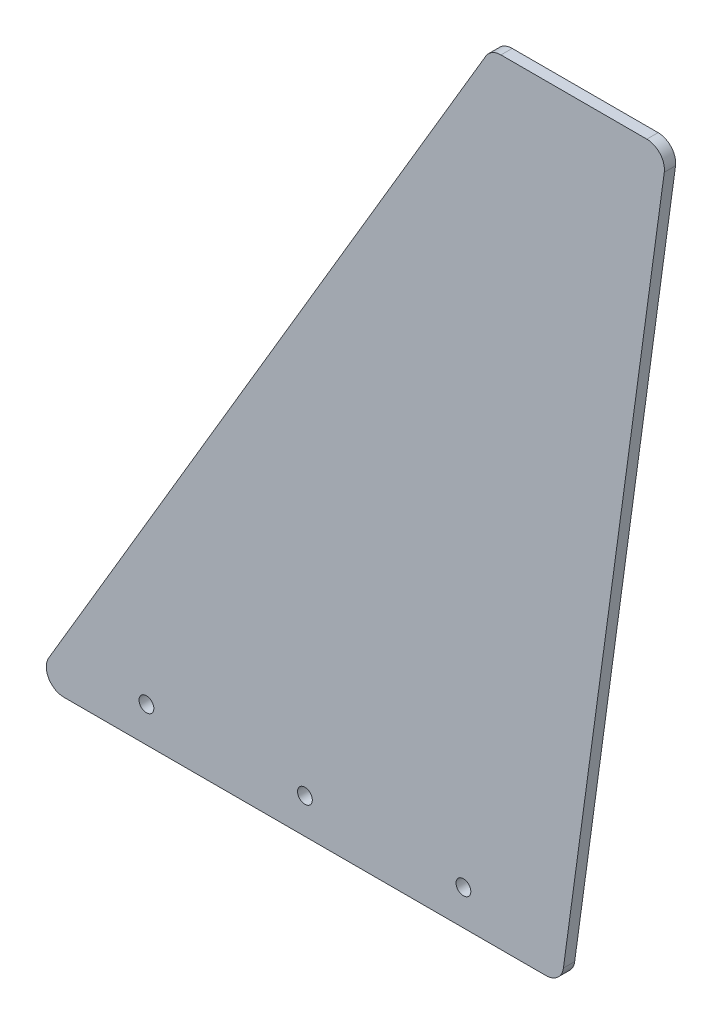
ISO-10303-21;
HEADER;
FILE_DESCRIPTION(('STEP AP214'),'2;1');
FILE_NAME('part.step','',(''),(''),'','','');
FILE_SCHEMA(('AUTOMOTIVE_DESIGN { 1 0 10303 214 1 1 1 1 }'));
ENDSEC;
DATA;
#1=APPLICATION_CONTEXT('core data for automotive mechanical design processes');
#2=APPLICATION_PROTOCOL_DEFINITION('international standard','automotive_design',2000,#1);
#3=PRODUCT_CONTEXT('',#1,'mechanical');
#4=PRODUCT('Part','Part','',(#3));
#5=PRODUCT_RELATED_PRODUCT_CATEGORY('part','',(#4));
#6=PRODUCT_DEFINITION_FORMATION('','',#4);
#7=PRODUCT_DEFINITION_CONTEXT('part definition',#1,'design');
#8=PRODUCT_DEFINITION('design','',#6,#7);
#9=PRODUCT_DEFINITION_SHAPE('','',#8);
#10=(LENGTH_UNIT() NAMED_UNIT(*) SI_UNIT(.MILLI.,.METRE.));
#11=(NAMED_UNIT(*) PLANE_ANGLE_UNIT() SI_UNIT($,.RADIAN.));
#12=(NAMED_UNIT(*) SI_UNIT($,.STERADIAN.) SOLID_ANGLE_UNIT());
#13=UNCERTAINTY_MEASURE_WITH_UNIT(LENGTH_MEASURE(1.E-05),#10,'distance_accuracy_value','');
#14=(GEOMETRIC_REPRESENTATION_CONTEXT(3) GLOBAL_UNCERTAINTY_ASSIGNED_CONTEXT((#13)) GLOBAL_UNIT_ASSIGNED_CONTEXT((#10,
#11,#12)) REPRESENTATION_CONTEXT('',''));
#15=CARTESIAN_POINT('',(0.,0.,0.));
#16=DIRECTION('',(0.,0.,1.));
#17=DIRECTION('',(1.,0.,0.));
#18=AXIS2_PLACEMENT_3D('',#15,#16,#17);
#19=CARTESIAN_POINT('',(130.,220.,3.2));
#20=DIRECTION('',(0.860926528214316,-0.508729312126641,0.));
#21=DIRECTION('',(0.508729312126641,0.860926528214316,0.));
#22=AXIS2_PLACEMENT_3D('',#19,#20,#21);
#23=PLANE('',#22);
#24=DIRECTION('',(-0.508729312126641,-0.860926528214315,0.));
#25=VECTOR('',#24,1.);
#26=CARTESIAN_POINT('',(130.,220.,0.));
#27=LINE('',#26,#25);
#28=CARTESIAN_POINT('',(128.548518422192,217.543646560633,0.));
#29=VERTEX_POINT('',#28);
#30=CARTESIAN_POINT('',(4.45760933128331,7.54364656063328,0.));
#31=VERTEX_POINT('',#30);
#32=EDGE_CURVE('E134',#29,#31,#27,.T.);
#33=ORIENTED_EDGE('',*,*,#32,.T.);
#34=DIRECTION('',(0.,0.,-1.));
#35=VECTOR('',#34,1.);
#36=CARTESIAN_POINT('',(4.45760933128331,7.54364656063325,3.2));
#37=LINE('',#36,#35);
#38=CARTESIAN_POINT('',(4.45760933128331,7.54364656063328,3.2));
#39=VERTEX_POINT('',#38);
#40=EDGE_CURVE('E112',#31,#39,#37,.F.);
#41=ORIENTED_EDGE('',*,*,#40,.T.);
#42=DIRECTION('',(-0.508729312126641,-0.860926528214315,0.));
#43=VECTOR('',#42,1.);
#44=CARTESIAN_POINT('',(130.,220.,3.2));
#45=LINE('',#44,#43);
#46=CARTESIAN_POINT('',(128.548518422192,217.543646560633,3.2));
#47=VERTEX_POINT('',#46);
#48=EDGE_CURVE('E144',#47,#39,#45,.T.);
#49=ORIENTED_EDGE('',*,*,#48,.F.);
#50=DIRECTION('',(0.,0.,-1.));
#51=VECTOR('',#50,1.);
#52=CARTESIAN_POINT('',(128.548518422192,217.543646560633,3.2));
#53=LINE('',#52,#51);
#54=EDGE_CURVE('E117',#47,#29,#53,.T.);
#55=ORIENTED_EDGE('',*,*,#54,.T.);
#56=EDGE_LOOP('',(#33,#41,#49,#55));
#57=FACE_BOUND('',#56,.T.);
#58=ADVANCED_FACE('F41',(#57),#23,.F.);
#59=CARTESIAN_POINT('',(0.,0.,3.2));
#60=DIRECTION('',(0.,1.,0.));
#61=DIRECTION('',(0.,0.,1.));
#62=AXIS2_PLACEMENT_3D('',#59,#60,#61);
#63=PLANE('',#62);
#64=DIRECTION('',(1.,0.,0.));
#65=VECTOR('',#64,1.);
#66=CARTESIAN_POINT('',(0.,0.,3.2));
#67=LINE('',#66,#65);
#68=CARTESIAN_POINT('',(8.76224197235489,0.,3.2));
#69=VERTEX_POINT('',#68);
#70=CARTESIAN_POINT('',(145.635544702006,0.,3.2));
#71=VERTEX_POINT('',#70);
#72=EDGE_CURVE('E127',#69,#71,#67,.T.);
#73=ORIENTED_EDGE('',*,*,#72,.F.);
#74=DIRECTION('',(0.,0.,-1.));
#75=VECTOR('',#74,1.);
#76=CARTESIAN_POINT('',(8.76224197235489,0.,3.2));
#77=LINE('',#76,#75);
#78=CARTESIAN_POINT('',(8.76224197235489,0.,0.));
#79=VERTEX_POINT('',#78);
#80=EDGE_CURVE('E111',#69,#79,#77,.T.);
#81=ORIENTED_EDGE('',*,*,#80,.T.);
#82=DIRECTION('',(1.,0.,0.));
#83=VECTOR('',#82,1.);
#84=CARTESIAN_POINT('',(0.,0.,0.));
#85=LINE('',#84,#83);
#86=CARTESIAN_POINT('',(145.635544702006,0.,0.));
#87=VERTEX_POINT('',#86);
#88=EDGE_CURVE('E124',#79,#87,#85,.T.);
#89=ORIENTED_EDGE('',*,*,#88,.T.);
#90=DIRECTION('',(0.,0.,-1.));
#91=VECTOR('',#90,1.);
#92=CARTESIAN_POINT('',(145.635544702006,0.,3.2));
#93=LINE('',#92,#91);
#94=EDGE_CURVE('E129',#87,#71,#93,.F.);
#95=ORIENTED_EDGE('',*,*,#94,.T.);
#96=EDGE_LOOP('',(#73,#81,#89,#95));
#97=FACE_BOUND('',#96,.T.);
#98=ADVANCED_FACE('F123',(#97),#63,.F.);
#99=CARTESIAN_POINT('',(150.,0.,3.2));
#100=DIRECTION('',(-0.990830168044299,0.135113204733313,0.));
#101=DIRECTION('',(-0.135113204733313,-0.990830168044299,0.));
#102=AXIS2_PLACEMENT_3D('',#99,#100,#101);
#103=PLANE('',#102);
#104=DIRECTION('',(0.135113204733313,0.990830168044299,0.));
#105=VECTOR('',#104,1.);
#106=CARTESIAN_POINT('',(150.,0.,3.2));
#107=LINE('',#106,#105);
#108=CARTESIAN_POINT('',(150.589695542227,4.32443397633344,3.2));
#109=VERTEX_POINT('',#108);
#110=CARTESIAN_POINT('',(179.226059178591,214.324433976333,3.2));
#111=VERTEX_POINT('',#110);
#112=EDGE_CURVE('E170',#109,#111,#107,.T.);
#113=ORIENTED_EDGE('',*,*,#112,.F.);
#114=DIRECTION('',(0.,0.,-1.));
#115=VECTOR('',#114,1.);
#116=CARTESIAN_POINT('',(150.589695542227,4.32443397633343,3.2));
#117=LINE('',#116,#115);
#118=CARTESIAN_POINT('',(150.589695542227,4.32443397633344,0.));
#119=VERTEX_POINT('',#118);
#120=EDGE_CURVE('E163',#109,#119,#117,.T.);
#121=ORIENTED_EDGE('',*,*,#120,.T.);
#122=DIRECTION('',(0.135113204733313,0.990830168044299,0.));
#123=VECTOR('',#122,1.);
#124=CARTESIAN_POINT('',(150.,0.,0.));
#125=LINE('',#124,#123);
#126=CARTESIAN_POINT('',(179.226059178591,214.324433976333,0.));
#127=VERTEX_POINT('',#126);
#128=EDGE_CURVE('E133',#119,#127,#125,.T.);
#129=ORIENTED_EDGE('',*,*,#128,.T.);
#130=DIRECTION('',(0.,0.,-1.));
#131=VECTOR('',#130,1.);
#132=CARTESIAN_POINT('',(179.226059178591,214.324433976333,3.2));
#133=LINE('',#132,#131);
#134=EDGE_CURVE('E161',#127,#111,#133,.F.);
#135=ORIENTED_EDGE('',*,*,#134,.T.);
#136=EDGE_LOOP('',(#113,#121,#129,#135));
#137=FACE_BOUND('',#136,.T.);
#138=ADVANCED_FACE('F168',(#137),#103,.F.);
#139=CARTESIAN_POINT('',(180.,220.,3.2));
#140=DIRECTION('',(0.,-1.,0.));
#141=DIRECTION('',(0.,0.,-1.));
#142=AXIS2_PLACEMENT_3D('',#139,#140,#141);
#143=PLANE('',#142);
#144=DIRECTION('',(-1.,0.,0.));
#145=VECTOR('',#144,1.);
#146=CARTESIAN_POINT('',(180.,220.,3.2));
#147=LINE('',#146,#145);
#148=CARTESIAN_POINT('',(174.271908338369,220.,3.2));
#149=VERTEX_POINT('',#148);
#150=CARTESIAN_POINT('',(132.853151063264,220.,3.2));
#151=VERTEX_POINT('',#150);
#152=EDGE_CURVE('E145',#149,#151,#147,.T.);
#153=ORIENTED_EDGE('',*,*,#152,.F.);
#154=DIRECTION('',(0.,0.,-1.));
#155=VECTOR('',#154,1.);
#156=CARTESIAN_POINT('',(174.271908338369,220.,3.2));
#157=LINE('',#156,#155);
#158=CARTESIAN_POINT('',(174.271908338369,220.,0.));
#159=VERTEX_POINT('',#158);
#160=EDGE_CURVE('E11',#149,#159,#157,.T.);
#161=ORIENTED_EDGE('',*,*,#160,.T.);
#162=DIRECTION('',(-1.,0.,0.));
#163=VECTOR('',#162,1.);
#164=CARTESIAN_POINT('',(180.,220.,0.));
#165=LINE('',#164,#163);
#166=CARTESIAN_POINT('',(132.853151063264,220.,0.));
#167=VERTEX_POINT('',#166);
#168=EDGE_CURVE('E137',#159,#167,#165,.T.);
#169=ORIENTED_EDGE('',*,*,#168,.T.);
#170=DIRECTION('',(0.,0.,-1.));
#171=VECTOR('',#170,1.);
#172=CARTESIAN_POINT('',(132.853151063264,220.,3.2));
#173=LINE('',#172,#171);
#174=EDGE_CURVE('E49',#167,#151,#173,.F.);
#175=ORIENTED_EDGE('',*,*,#174,.T.);
#176=EDGE_LOOP('',(#153,#161,#169,#175));
#177=FACE_BOUND('',#176,.T.);
#178=ADVANCED_FACE('F177',(#177),#143,.F.);
#179=CARTESIAN_POINT('',(0.,0.,3.2));
#180=DIRECTION('',(0.,0.,1.));
#181=DIRECTION('',(1.,0.,0.));
#182=AXIS2_PLACEMENT_3D('',#179,#180,#181);
#183=PLANE('',#182);
#184=CARTESIAN_POINT('',(122.19889333718,10.,3.2));
#185=DIRECTION('',(0.,0.,1.));
#186=DIRECTION('',(1.,0.,0.));
#187=AXIS2_PLACEMENT_3D('',#184,#185,#186);
#188=CIRCLE('',#187,2.1);
#189=CARTESIAN_POINT('',(124.29889333718,10.,3.2));
#190=VERTEX_POINT('',#189);
#191=EDGE_CURVE('E187',#190,#190,#188,.T.);
#192=ORIENTED_EDGE('',*,*,#191,.F.);
#193=EDGE_LOOP('',(#192));
#194=FACE_BOUND('',#193,.T.);
#195=CARTESIAN_POINT('',(32.1988933371803,10.,3.2));
#196=DIRECTION('',(0.,0.,1.));
#197=DIRECTION('',(1.,0.,0.));
#198=AXIS2_PLACEMENT_3D('',#195,#196,#197);
#199=CIRCLE('',#198,2.1);
#200=CARTESIAN_POINT('',(34.2988933371804,10.,3.2));
#201=VERTEX_POINT('',#200);
#202=EDGE_CURVE('E190',#201,#201,#199,.T.);
#203=ORIENTED_EDGE('',*,*,#202,.F.);
#204=EDGE_LOOP('',(#203));
#205=FACE_BOUND('',#204,.T.);
#206=CARTESIAN_POINT('',(77.1988933371803,10.,3.2));
#207=DIRECTION('',(0.,0.,1.));
#208=DIRECTION('',(1.,0.,0.));
#209=AXIS2_PLACEMENT_3D('',#206,#207,#208);
#210=CIRCLE('',#209,2.1);
#211=CARTESIAN_POINT('',(79.2988933371803,10.,3.2));
#212=VERTEX_POINT('',#211);
#213=EDGE_CURVE('E184',#212,#212,#210,.T.);
#214=ORIENTED_EDGE('',*,*,#213,.F.);
#215=EDGE_LOOP('',(#214));
#216=FACE_BOUND('',#215,.T.);
#217=ORIENTED_EDGE('',*,*,#48,.T.);
#218=CARTESIAN_POINT('',(8.76224197235489,5.,3.2));
#219=DIRECTION('',(0.,0.,1.));
#220=DIRECTION('',(1.,0.,0.));
#221=AXIS2_PLACEMENT_3D('',#218,#219,#220);
#222=CIRCLE('',#221,5.);
#223=EDGE_CURVE('E159',#39,#69,#222,.T.);
#224=ORIENTED_EDGE('',*,*,#223,.T.);
#225=ORIENTED_EDGE('',*,*,#72,.T.);
#226=CARTESIAN_POINT('',(145.635544702006,5.,3.2));
#227=DIRECTION('',(0.,0.,1.));
#228=DIRECTION('',(1.,0.,0.));
#229=AXIS2_PLACEMENT_3D('',#226,#227,#228);
#230=CIRCLE('',#229,5.);
#231=EDGE_CURVE('E157',#71,#109,#230,.T.);
#232=ORIENTED_EDGE('',*,*,#231,.T.);
#233=ORIENTED_EDGE('',*,*,#112,.T.);
#234=CARTESIAN_POINT('',(174.271908338369,215.,3.2));
#235=DIRECTION('',(0.,0.,1.));
#236=DIRECTION('',(1.,0.,0.));
#237=AXIS2_PLACEMENT_3D('',#234,#235,#236);
#238=CIRCLE('',#237,5.);
#239=EDGE_CURVE('E62',#111,#149,#238,.T.);
#240=ORIENTED_EDGE('',*,*,#239,.T.);
#241=ORIENTED_EDGE('',*,*,#152,.T.);
#242=CARTESIAN_POINT('',(132.853151063264,215.,3.2));
#243=DIRECTION('',(0.,0.,1.));
#244=DIRECTION('',(1.,0.,0.));
#245=AXIS2_PLACEMENT_3D('',#242,#243,#244);
#246=CIRCLE('',#245,5.);
#247=EDGE_CURVE('E154',#151,#47,#246,.T.);
#248=ORIENTED_EDGE('',*,*,#247,.T.);
#249=EDGE_LOOP('',(#217,#224,#225,#232,#233,#240,#241,#248));
#250=FACE_BOUND('',#249,.T.);
#251=ADVANCED_FACE('F211',(#194,#205,#216,#250),#183,.T.);
#252=CARTESIAN_POINT('',(0.,0.,0.));
#253=DIRECTION('',(0.,0.,1.));
#254=DIRECTION('',(1.,0.,0.));
#255=AXIS2_PLACEMENT_3D('',#252,#253,#254);
#256=PLANE('',#255);
#257=CARTESIAN_POINT('',(122.19889333718,10.,0.));
#258=DIRECTION('',(0.,0.,1.));
#259=DIRECTION('',(1.,0.,0.));
#260=AXIS2_PLACEMENT_3D('',#257,#258,#259);
#261=CIRCLE('',#260,2.1);
#262=CARTESIAN_POINT('',(124.29889333718,10.,0.));
#263=VERTEX_POINT('',#262);
#264=EDGE_CURVE('E193',#263,#263,#261,.T.);
#265=ORIENTED_EDGE('',*,*,#264,.T.);
#266=EDGE_LOOP('',(#265));
#267=FACE_BOUND('',#266,.T.);
#268=CARTESIAN_POINT('',(32.1988933371803,10.,0.));
#269=DIRECTION('',(0.,0.,1.));
#270=DIRECTION('',(1.,0.,0.));
#271=AXIS2_PLACEMENT_3D('',#268,#269,#270);
#272=CIRCLE('',#271,2.1);
#273=CARTESIAN_POINT('',(34.2988933371804,10.,0.));
#274=VERTEX_POINT('',#273);
#275=EDGE_CURVE('E194',#274,#274,#272,.T.);
#276=ORIENTED_EDGE('',*,*,#275,.T.);
#277=EDGE_LOOP('',(#276));
#278=FACE_BOUND('',#277,.T.);
#279=CARTESIAN_POINT('',(77.1988933371803,10.,0.));
#280=DIRECTION('',(0.,0.,1.));
#281=DIRECTION('',(1.,0.,0.));
#282=AXIS2_PLACEMENT_3D('',#279,#280,#281);
#283=CIRCLE('',#282,2.1);
#284=CARTESIAN_POINT('',(79.2988933371803,10.,0.));
#285=VERTEX_POINT('',#284);
#286=EDGE_CURVE('E139',#285,#285,#283,.T.);
#287=ORIENTED_EDGE('',*,*,#286,.T.);
#288=EDGE_LOOP('',(#287));
#289=FACE_BOUND('',#288,.T.);
#290=ORIENTED_EDGE('',*,*,#88,.F.);
#291=CARTESIAN_POINT('',(8.76224197235489,5.,0.));
#292=DIRECTION('',(0.,0.,1.));
#293=DIRECTION('',(1.,0.,0.));
#294=AXIS2_PLACEMENT_3D('',#291,#292,#293);
#295=CIRCLE('',#294,5.);
#296=EDGE_CURVE('E107',#79,#31,#295,.F.);
#297=ORIENTED_EDGE('',*,*,#296,.T.);
#298=ORIENTED_EDGE('',*,*,#32,.F.);
#299=CARTESIAN_POINT('',(132.853151063264,215.,0.));
#300=DIRECTION('',(0.,0.,1.));
#301=DIRECTION('',(1.,0.,0.));
#302=AXIS2_PLACEMENT_3D('',#299,#300,#301);
#303=CIRCLE('',#302,5.);
#304=EDGE_CURVE('E128',#29,#167,#303,.F.);
#305=ORIENTED_EDGE('',*,*,#304,.T.);
#306=ORIENTED_EDGE('',*,*,#168,.F.);
#307=CARTESIAN_POINT('',(174.271908338369,215.,0.));
#308=DIRECTION('',(0.,0.,1.));
#309=DIRECTION('',(1.,0.,0.));
#310=AXIS2_PLACEMENT_3D('',#307,#308,#309);
#311=CIRCLE('',#310,5.);
#312=EDGE_CURVE('E148',#159,#127,#311,.F.);
#313=ORIENTED_EDGE('',*,*,#312,.T.);
#314=ORIENTED_EDGE('',*,*,#128,.F.);
#315=CARTESIAN_POINT('',(145.635544702006,5.,0.));
#316=DIRECTION('',(0.,0.,1.));
#317=DIRECTION('',(1.,0.,0.));
#318=AXIS2_PLACEMENT_3D('',#315,#316,#317);
#319=CIRCLE('',#318,5.);
#320=EDGE_CURVE('E118',#119,#87,#319,.F.);
#321=ORIENTED_EDGE('',*,*,#320,.T.);
#322=EDGE_LOOP('',(#290,#297,#298,#305,#306,#313,#314,#321));
#323=FACE_BOUND('',#322,.T.);
#324=ADVANCED_FACE('F131',(#267,#278,#289,#323),#256,.F.);
#325=CARTESIAN_POINT('',(8.76224197235489,5.,3.2));
#326=DIRECTION('',(0.,0.,-1.));
#327=DIRECTION('',(-1.,0.,0.));
#328=AXIS2_PLACEMENT_3D('',#325,#326,#327);
#329=CYLINDRICAL_SURFACE('',#328,5.);
#330=ORIENTED_EDGE('',*,*,#223,.F.);
#331=ORIENTED_EDGE('',*,*,#40,.F.);
#332=ORIENTED_EDGE('',*,*,#296,.F.);
#333=ORIENTED_EDGE('',*,*,#80,.F.);
#334=EDGE_LOOP('',(#330,#331,#332,#333));
#335=FACE_BOUND('',#334,.T.);
#336=ADVANCED_FACE('F110',(#335),#329,.T.);
#337=CARTESIAN_POINT('',(145.635544702006,5.,3.2));
#338=DIRECTION('',(0.,0.,-1.));
#339=DIRECTION('',(-1.,0.,0.));
#340=AXIS2_PLACEMENT_3D('',#337,#338,#339);
#341=CYLINDRICAL_SURFACE('',#340,5.);
#342=ORIENTED_EDGE('',*,*,#231,.F.);
#343=ORIENTED_EDGE('',*,*,#94,.F.);
#344=ORIENTED_EDGE('',*,*,#320,.F.);
#345=ORIENTED_EDGE('',*,*,#120,.F.);
#346=EDGE_LOOP('',(#342,#343,#344,#345));
#347=FACE_BOUND('',#346,.T.);
#348=ADVANCED_FACE('F230',(#347),#341,.T.);
#349=CARTESIAN_POINT('',(174.271908338369,215.,3.2));
#350=DIRECTION('',(0.,0.,-1.));
#351=DIRECTION('',(-1.,0.,0.));
#352=AXIS2_PLACEMENT_3D('',#349,#350,#351);
#353=CYLINDRICAL_SURFACE('',#352,5.);
#354=ORIENTED_EDGE('',*,*,#239,.F.);
#355=ORIENTED_EDGE('',*,*,#134,.F.);
#356=ORIENTED_EDGE('',*,*,#312,.F.);
#357=ORIENTED_EDGE('',*,*,#160,.F.);
#358=EDGE_LOOP('',(#354,#355,#356,#357));
#359=FACE_BOUND('',#358,.T.);
#360=ADVANCED_FACE('F176',(#359),#353,.T.);
#361=CARTESIAN_POINT('',(132.853151063264,215.,3.2));
#362=DIRECTION('',(0.,0.,-1.));
#363=DIRECTION('',(-1.,0.,0.));
#364=AXIS2_PLACEMENT_3D('',#361,#362,#363);
#365=CYLINDRICAL_SURFACE('',#364,5.);
#366=ORIENTED_EDGE('',*,*,#247,.F.);
#367=ORIENTED_EDGE('',*,*,#174,.F.);
#368=ORIENTED_EDGE('',*,*,#304,.F.);
#369=ORIENTED_EDGE('',*,*,#54,.F.);
#370=EDGE_LOOP('',(#366,#367,#368,#369));
#371=FACE_BOUND('',#370,.T.);
#372=ADVANCED_FACE('F43',(#371),#365,.T.);
#373=CARTESIAN_POINT('',(77.1988933371803,10.,0.));
#374=DIRECTION('',(0.,0.,1.));
#375=DIRECTION('',(1.,0.,0.));
#376=AXIS2_PLACEMENT_3D('',#373,#374,#375);
#377=CYLINDRICAL_SURFACE('',#376,2.1);
#378=ORIENTED_EDGE('',*,*,#286,.F.);
#379=EDGE_LOOP('',(#378));
#380=FACE_BOUND('',#379,.T.);
#381=ORIENTED_EDGE('',*,*,#213,.T.);
#382=EDGE_LOOP('',(#381));
#383=FACE_BOUND('',#382,.T.);
#384=ADVANCED_FACE('F223',(#380,#383),#377,.F.);
#385=CARTESIAN_POINT('',(32.1988933371803,10.,0.));
#386=DIRECTION('',(0.,0.,1.));
#387=DIRECTION('',(1.,0.,0.));
#388=AXIS2_PLACEMENT_3D('',#385,#386,#387);
#389=CYLINDRICAL_SURFACE('',#388,2.1);
#390=ORIENTED_EDGE('',*,*,#275,.F.);
#391=EDGE_LOOP('',(#390));
#392=FACE_BOUND('',#391,.T.);
#393=ORIENTED_EDGE('',*,*,#202,.T.);
#394=EDGE_LOOP('',(#393));
#395=FACE_BOUND('',#394,.T.);
#396=ADVANCED_FACE('F207',(#392,#395),#389,.F.);
#397=CARTESIAN_POINT('',(122.19889333718,10.,0.));
#398=DIRECTION('',(0.,0.,1.));
#399=DIRECTION('',(1.,0.,0.));
#400=AXIS2_PLACEMENT_3D('',#397,#398,#399);
#401=CYLINDRICAL_SURFACE('',#400,2.1);
#402=ORIENTED_EDGE('',*,*,#264,.F.);
#403=EDGE_LOOP('',(#402));
#404=FACE_BOUND('',#403,.T.);
#405=ORIENTED_EDGE('',*,*,#191,.T.);
#406=EDGE_LOOP('',(#405));
#407=FACE_BOUND('',#406,.T.);
#408=ADVANCED_FACE('F204',(#404,#407),#401,.F.);
#409=CLOSED_SHELL('',(#58,#98,#138,#178,#251,#324,#336,#348,#360,#372,#384,#396,#408));
#410=MANIFOLD_SOLID_BREP('B2',#409);
#411=ADVANCED_BREP_SHAPE_REPRESENTATION('',(#18,#410),#14);
#412=SHAPE_DEFINITION_REPRESENTATION(#9,#411);
ENDSEC;
END-ISO-10303-21;
